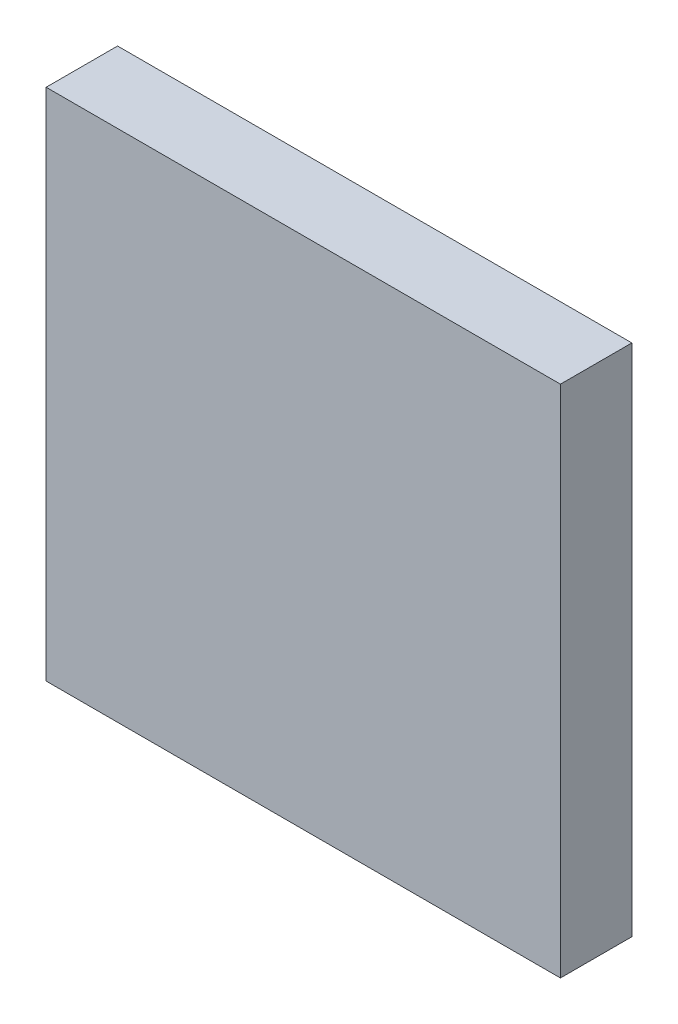
ISO-10303-21;
HEADER;
FILE_DESCRIPTION(('STEP AP214'),'2;1');
FILE_NAME('part.step','',(''),(''),'','','');
FILE_SCHEMA(('AUTOMOTIVE_DESIGN { 1 0 10303 214 1 1 1 1 }'));
ENDSEC;
DATA;
#1=APPLICATION_CONTEXT('core data for automotive mechanical design processes');
#2=APPLICATION_PROTOCOL_DEFINITION('international standard','automotive_design',2000,#1);
#3=PRODUCT_CONTEXT('',#1,'mechanical');
#4=PRODUCT('Part','Part','',(#3));
#5=PRODUCT_RELATED_PRODUCT_CATEGORY('part','',(#4));
#6=PRODUCT_DEFINITION_FORMATION('','',#4);
#7=PRODUCT_DEFINITION_CONTEXT('part definition',#1,'design');
#8=PRODUCT_DEFINITION('design','',#6,#7);
#9=PRODUCT_DEFINITION_SHAPE('','',#8);
#10=(LENGTH_UNIT() NAMED_UNIT(*) SI_UNIT(.MILLI.,.METRE.));
#11=(NAMED_UNIT(*) PLANE_ANGLE_UNIT() SI_UNIT($,.RADIAN.));
#12=(NAMED_UNIT(*) SI_UNIT($,.STERADIAN.) SOLID_ANGLE_UNIT());
#13=UNCERTAINTY_MEASURE_WITH_UNIT(LENGTH_MEASURE(1.E-05),#10,'distance_accuracy_value','');
#14=(GEOMETRIC_REPRESENTATION_CONTEXT(3) GLOBAL_UNCERTAINTY_ASSIGNED_CONTEXT((#13)) GLOBAL_UNIT_ASSIGNED_CONTEXT((#10,
#11,#12)) REPRESENTATION_CONTEXT('',''));
#15=CARTESIAN_POINT('',(0.,0.,0.));
#16=DIRECTION('',(0.,0.,1.));
#17=DIRECTION('',(1.,0.,0.));
#18=AXIS2_PLACEMENT_3D('',#15,#16,#17);
#19=CARTESIAN_POINT('',(0.,0.,0.));
#20=DIRECTION('',(0.,0.,1.));
#21=DIRECTION('',(1.,0.,0.));
#22=AXIS2_PLACEMENT_3D('',#19,#20,#21);
#23=PLANE('',#22);
#24=DIRECTION('',(0.,-1.,0.));
#25=VECTOR('',#24,1.);
#26=CARTESIAN_POINT('',(-0.154076439477094,2.24242424242424,0.));
#27=LINE('',#26,#25);
#28=CARTESIAN_POINT('',(-0.154076439477094,2.24242424242424,0.));
#29=VERTEX_POINT('',#28);
#30=CARTESIAN_POINT('',(-0.15407643947709,-33.7575757575758,0.));
#31=VERTEX_POINT('',#30);
#32=EDGE_CURVE('E79',#29,#31,#27,.T.);
#33=ORIENTED_EDGE('',*,*,#32,.F.);
#34=DIRECTION('',(-1.,0.,0.));
#35=VECTOR('',#34,1.);
#36=CARTESIAN_POINT('',(-0.154076439477094,2.24242424242424,0.));
#37=LINE('',#36,#35);
#38=CARTESIAN_POINT('',(35.8459235605229,2.24242424242424,0.));
#39=VERTEX_POINT('',#38);
#40=EDGE_CURVE('E48',#39,#29,#37,.T.);
#41=ORIENTED_EDGE('',*,*,#40,.F.);
#42=DIRECTION('',(0.,1.,0.));
#43=VECTOR('',#42,1.);
#44=CARTESIAN_POINT('',(35.8459235605229,2.24242424242424,0.));
#45=LINE('',#44,#43);
#46=CARTESIAN_POINT('',(35.8459235605229,-33.7575757575758,0.));
#47=VERTEX_POINT('',#46);
#48=EDGE_CURVE('E56',#47,#39,#45,.T.);
#49=ORIENTED_EDGE('',*,*,#48,.F.);
#50=DIRECTION('',(1.,0.,0.));
#51=VECTOR('',#50,1.);
#52=CARTESIAN_POINT('',(-0.15407643947709,-33.7575757575758,0.));
#53=LINE('',#52,#51);
#54=EDGE_CURVE('E146',#31,#47,#53,.T.);
#55=ORIENTED_EDGE('',*,*,#54,.F.);
#56=EDGE_LOOP('',(#33,#41,#49,#55));
#57=FACE_BOUND('',#56,.T.);
#58=CARTESIAN_POINT('',(2.5959235605229,-0.507575757575758,0.));
#59=DIRECTION('',(0.,0.,1.));
#60=DIRECTION('',(1.,0.,0.));
#61=AXIS2_PLACEMENT_3D('',#58,#59,#60);
#62=CIRCLE('',#61,2.);
#63=CARTESIAN_POINT('',(4.5959235605229,-0.507575757575758,0.));
#64=VERTEX_POINT('',#63);
#65=EDGE_CURVE('E142',#64,#64,#62,.T.);
#66=ORIENTED_EDGE('',*,*,#65,.T.);
#67=EDGE_LOOP('',(#66));
#68=FACE_BOUND('',#67,.T.);
#69=CARTESIAN_POINT('',(17.8459235605229,-0.507575757575758,0.));
#70=DIRECTION('',(0.,0.,1.));
#71=DIRECTION('',(1.,0.,0.));
#72=AXIS2_PLACEMENT_3D('',#69,#70,#71);
#73=CIRCLE('',#72,2.);
#74=CARTESIAN_POINT('',(19.8459235605229,-0.507575757575758,0.));
#75=VERTEX_POINT('',#74);
#76=EDGE_CURVE('E139',#75,#75,#73,.T.);
#77=ORIENTED_EDGE('',*,*,#76,.T.);
#78=EDGE_LOOP('',(#77));
#79=FACE_BOUND('',#78,.T.);
#80=CARTESIAN_POINT('',(33.0959235605229,-0.507575757575759,0.));
#81=DIRECTION('',(0.,0.,1.));
#82=DIRECTION('',(1.,0.,0.));
#83=AXIS2_PLACEMENT_3D('',#80,#81,#82);
#84=CIRCLE('',#83,2.);
#85=CARTESIAN_POINT('',(35.0959235605229,-0.507575757575759,0.));
#86=VERTEX_POINT('',#85);
#87=EDGE_CURVE('E136',#86,#86,#84,.T.);
#88=ORIENTED_EDGE('',*,*,#87,.T.);
#89=EDGE_LOOP('',(#88));
#90=FACE_BOUND('',#89,.T.);
#91=CARTESIAN_POINT('',(33.0959235605229,-15.7575757575758,0.));
#92=DIRECTION('',(0.,0.,1.));
#93=DIRECTION('',(1.,0.,0.));
#94=AXIS2_PLACEMENT_3D('',#91,#92,#93);
#95=CIRCLE('',#94,2.);
#96=CARTESIAN_POINT('',(35.0959235605229,-15.7575757575758,0.));
#97=VERTEX_POINT('',#96);
#98=EDGE_CURVE('E133',#97,#97,#95,.T.);
#99=ORIENTED_EDGE('',*,*,#98,.T.);
#100=EDGE_LOOP('',(#99));
#101=FACE_BOUND('',#100,.T.);
#102=CARTESIAN_POINT('',(33.0959235605229,-31.0075757575758,0.));
#103=DIRECTION('',(0.,0.,1.));
#104=DIRECTION('',(1.,0.,0.));
#105=AXIS2_PLACEMENT_3D('',#102,#103,#104);
#106=CIRCLE('',#105,2.);
#107=CARTESIAN_POINT('',(35.0959235605229,-31.0075757575758,0.));
#108=VERTEX_POINT('',#107);
#109=EDGE_CURVE('E130',#108,#108,#106,.T.);
#110=ORIENTED_EDGE('',*,*,#109,.T.);
#111=EDGE_LOOP('',(#110));
#112=FACE_BOUND('',#111,.T.);
#113=CARTESIAN_POINT('',(17.8459235605229,-31.0075757575758,0.));
#114=DIRECTION('',(0.,0.,1.));
#115=DIRECTION('',(1.,0.,0.));
#116=AXIS2_PLACEMENT_3D('',#113,#114,#115);
#117=CIRCLE('',#116,2.00000000000001);
#118=CARTESIAN_POINT('',(19.8459235605229,-31.0075757575758,0.));
#119=VERTEX_POINT('',#118);
#120=EDGE_CURVE('E127',#119,#119,#117,.T.);
#121=ORIENTED_EDGE('',*,*,#120,.T.);
#122=EDGE_LOOP('',(#121));
#123=FACE_BOUND('',#122,.T.);
#124=CARTESIAN_POINT('',(2.5959235605229,-31.0075757575758,0.));
#125=DIRECTION('',(0.,0.,1.));
#126=DIRECTION('',(1.,0.,0.));
#127=AXIS2_PLACEMENT_3D('',#124,#125,#126);
#128=CIRCLE('',#127,2.);
#129=CARTESIAN_POINT('',(4.5959235605229,-31.0075757575758,0.));
#130=VERTEX_POINT('',#129);
#131=EDGE_CURVE('E124',#130,#130,#128,.T.);
#132=ORIENTED_EDGE('',*,*,#131,.T.);
#133=EDGE_LOOP('',(#132));
#134=FACE_BOUND('',#133,.T.);
#135=CARTESIAN_POINT('',(2.59592356052291,-15.7575757575758,0.));
#136=DIRECTION('',(0.,0.,1.));
#137=DIRECTION('',(1.,0.,0.));
#138=AXIS2_PLACEMENT_3D('',#135,#136,#137);
#139=CIRCLE('',#138,2.);
#140=CARTESIAN_POINT('',(4.59592356052291,-15.7575757575758,0.));
#141=VERTEX_POINT('',#140);
#142=EDGE_CURVE('E121',#141,#141,#139,.T.);
#143=ORIENTED_EDGE('',*,*,#142,.T.);
#144=EDGE_LOOP('',(#143));
#145=FACE_BOUND('',#144,.T.);
#146=ADVANCED_FACE('F33',(#57,#68,#79,#90,#101,#112,#123,#134,#145),#23,.F.);
#147=CARTESIAN_POINT('',(-0.154076439477094,2.24242424242424,3.));
#148=DIRECTION('',(1.,0.,0.));
#149=DIRECTION('',(0.,1.,0.));
#150=AXIS2_PLACEMENT_3D('',#147,#148,#149);
#151=PLANE('',#150);
#152=ORIENTED_EDGE('',*,*,#32,.T.);
#153=DIRECTION('',(0.,0.,-1.));
#154=VECTOR('',#153,1.);
#155=CARTESIAN_POINT('',(-0.15407643947709,-33.7575757575758,3.));
#156=LINE('',#155,#154);
#157=CARTESIAN_POINT('',(-0.154076439477094,-33.7575757575758,5.));
#158=VERTEX_POINT('',#157);
#159=EDGE_CURVE('E11',#158,#31,#156,.T.);
#160=ORIENTED_EDGE('',*,*,#159,.F.);
#161=DIRECTION('',(0.,-1.,0.));
#162=VECTOR('',#161,1.);
#163=CARTESIAN_POINT('',(-0.154076439477094,2.24242424242424,5.));
#164=LINE('',#163,#162);
#165=CARTESIAN_POINT('',(-0.154076439477094,2.24242424242424,5.));
#166=VERTEX_POINT('',#165);
#167=EDGE_CURVE('E77',#166,#158,#164,.T.);
#168=ORIENTED_EDGE('',*,*,#167,.F.);
#169=DIRECTION('',(0.,0.,-1.));
#170=VECTOR('',#169,1.);
#171=CARTESIAN_POINT('',(-0.154076439477094,2.24242424242424,3.));
#172=LINE('',#171,#170);
#173=EDGE_CURVE('E150',#166,#29,#172,.T.);
#174=ORIENTED_EDGE('',*,*,#173,.T.);
#175=EDGE_LOOP('',(#152,#160,#168,#174));
#176=FACE_BOUND('',#175,.T.);
#177=ADVANCED_FACE('F35',(#176),#151,.F.);
#178=CARTESIAN_POINT('',(-0.15407643947709,-33.7575757575758,3.));
#179=DIRECTION('',(0.,1.,0.));
#180=DIRECTION('',(0.,0.,1.));
#181=AXIS2_PLACEMENT_3D('',#178,#179,#180);
#182=PLANE('',#181);
#183=ORIENTED_EDGE('',*,*,#54,.T.);
#184=DIRECTION('',(0.,0.,-1.));
#185=VECTOR('',#184,1.);
#186=CARTESIAN_POINT('',(35.8459235605229,-33.7575757575758,3.));
#187=LINE('',#186,#185);
#188=CARTESIAN_POINT('',(35.8459235605229,-33.7575757575758,5.));
#189=VERTEX_POINT('',#188);
#190=EDGE_CURVE('E41',#189,#47,#187,.T.);
#191=ORIENTED_EDGE('',*,*,#190,.F.);
#192=DIRECTION('',(1.,0.,0.));
#193=VECTOR('',#192,1.);
#194=CARTESIAN_POINT('',(-0.154076439477094,-33.7575757575758,5.));
#195=LINE('',#194,#193);
#196=EDGE_CURVE('E82',#158,#189,#195,.T.);
#197=ORIENTED_EDGE('',*,*,#196,.F.);
#198=ORIENTED_EDGE('',*,*,#159,.T.);
#199=EDGE_LOOP('',(#183,#191,#197,#198));
#200=FACE_BOUND('',#199,.T.);
#201=ADVANCED_FACE('F83',(#200),#182,.F.);
#202=CARTESIAN_POINT('',(35.8459235605229,2.24242424242424,3.));
#203=DIRECTION('',(-1.,0.,0.));
#204=DIRECTION('',(0.,-1.,0.));
#205=AXIS2_PLACEMENT_3D('',#202,#203,#204);
#206=PLANE('',#205);
#207=ORIENTED_EDGE('',*,*,#48,.T.);
#208=DIRECTION('',(0.,0.,-1.));
#209=VECTOR('',#208,1.);
#210=CARTESIAN_POINT('',(35.8459235605229,2.24242424242424,3.));
#211=LINE('',#210,#209);
#212=CARTESIAN_POINT('',(35.8459235605229,2.24242424242424,5.));
#213=VERTEX_POINT('',#212);
#214=EDGE_CURVE('E152',#213,#39,#211,.T.);
#215=ORIENTED_EDGE('',*,*,#214,.F.);
#216=DIRECTION('',(0.,1.,0.));
#217=VECTOR('',#216,1.);
#218=CARTESIAN_POINT('',(35.8459235605229,2.24242424242424,5.));
#219=LINE('',#218,#217);
#220=EDGE_CURVE('E87',#189,#213,#219,.T.);
#221=ORIENTED_EDGE('',*,*,#220,.F.);
#222=ORIENTED_EDGE('',*,*,#190,.T.);
#223=EDGE_LOOP('',(#207,#215,#221,#222));
#224=FACE_BOUND('',#223,.T.);
#225=ADVANCED_FACE('F153',(#224),#206,.F.);
#226=CARTESIAN_POINT('',(-0.154076439477094,2.24242424242424,3.));
#227=DIRECTION('',(0.,-1.,0.));
#228=DIRECTION('',(0.,0.,-1.));
#229=AXIS2_PLACEMENT_3D('',#226,#227,#228);
#230=PLANE('',#229);
#231=ORIENTED_EDGE('',*,*,#40,.T.);
#232=ORIENTED_EDGE('',*,*,#173,.F.);
#233=DIRECTION('',(-1.,0.,0.));
#234=VECTOR('',#233,1.);
#235=CARTESIAN_POINT('',(-0.154076439477094,2.24242424242424,5.));
#236=LINE('',#235,#234);
#237=EDGE_CURVE('E92',#213,#166,#236,.T.);
#238=ORIENTED_EDGE('',*,*,#237,.F.);
#239=ORIENTED_EDGE('',*,*,#214,.T.);
#240=EDGE_LOOP('',(#231,#232,#238,#239));
#241=FACE_BOUND('',#240,.T.);
#242=ADVANCED_FACE('F214',(#241),#230,.F.);
#243=CARTESIAN_POINT('',(2.5959235605229,-0.507575757575758,3.));
#244=DIRECTION('',(0.,0.,-1.));
#245=DIRECTION('',(-1.,0.,0.));
#246=AXIS2_PLACEMENT_3D('',#243,#244,#245);
#247=CYLINDRICAL_SURFACE('',#246,2.);
#248=CARTESIAN_POINT('',(2.5959235605229,-0.507575757575758,3.));
#249=DIRECTION('',(0.,0.,1.));
#250=DIRECTION('',(1.,0.,0.));
#251=AXIS2_PLACEMENT_3D('',#248,#249,#250);
#252=CIRCLE('',#251,2.);
#253=CARTESIAN_POINT('',(4.5959235605229,-0.507575757575758,3.));
#254=VERTEX_POINT('',#253);
#255=EDGE_CURVE('E118',#254,#254,#252,.T.);
#256=ORIENTED_EDGE('',*,*,#255,.T.);
#257=EDGE_LOOP('',(#256));
#258=FACE_BOUND('',#257,.T.);
#259=ORIENTED_EDGE('',*,*,#65,.F.);
#260=EDGE_LOOP('',(#259));
#261=FACE_BOUND('',#260,.T.);
#262=ADVANCED_FACE('F211',(#258,#261),#247,.F.);
#263=CARTESIAN_POINT('',(17.8459235605229,-0.507575757575758,3.));
#264=DIRECTION('',(0.,0.,-1.));
#265=DIRECTION('',(-1.,0.,0.));
#266=AXIS2_PLACEMENT_3D('',#263,#264,#265);
#267=CYLINDRICAL_SURFACE('',#266,2.);
#268=CARTESIAN_POINT('',(17.8459235605229,-0.507575757575758,3.));
#269=DIRECTION('',(0.,0.,1.));
#270=DIRECTION('',(1.,0.,0.));
#271=AXIS2_PLACEMENT_3D('',#268,#269,#270);
#272=CIRCLE('',#271,2.);
#273=CARTESIAN_POINT('',(19.8459235605229,-0.507575757575758,3.));
#274=VERTEX_POINT('',#273);
#275=EDGE_CURVE('E115',#274,#274,#272,.T.);
#276=ORIENTED_EDGE('',*,*,#275,.T.);
#277=EDGE_LOOP('',(#276));
#278=FACE_BOUND('',#277,.T.);
#279=ORIENTED_EDGE('',*,*,#76,.F.);
#280=EDGE_LOOP('',(#279));
#281=FACE_BOUND('',#280,.T.);
#282=ADVANCED_FACE('F207',(#278,#281),#267,.F.);
#283=CARTESIAN_POINT('',(33.0959235605229,-0.507575757575759,3.));
#284=DIRECTION('',(0.,0.,-1.));
#285=DIRECTION('',(-1.,0.,0.));
#286=AXIS2_PLACEMENT_3D('',#283,#284,#285);
#287=CYLINDRICAL_SURFACE('',#286,2.);
#288=CARTESIAN_POINT('',(33.0959235605229,-0.507575757575759,3.));
#289=DIRECTION('',(0.,0.,1.));
#290=DIRECTION('',(1.,0.,0.));
#291=AXIS2_PLACEMENT_3D('',#288,#289,#290);
#292=CIRCLE('',#291,2.);
#293=CARTESIAN_POINT('',(35.0959235605229,-0.507575757575759,3.));
#294=VERTEX_POINT('',#293);
#295=EDGE_CURVE('E112',#294,#294,#292,.T.);
#296=ORIENTED_EDGE('',*,*,#295,.T.);
#297=EDGE_LOOP('',(#296));
#298=FACE_BOUND('',#297,.T.);
#299=ORIENTED_EDGE('',*,*,#87,.F.);
#300=EDGE_LOOP('',(#299));
#301=FACE_BOUND('',#300,.T.);
#302=ADVANCED_FACE('F203',(#298,#301),#287,.F.);
#303=CARTESIAN_POINT('',(33.0959235605229,-15.7575757575758,3.));
#304=DIRECTION('',(0.,0.,-1.));
#305=DIRECTION('',(-1.,0.,0.));
#306=AXIS2_PLACEMENT_3D('',#303,#304,#305);
#307=CYLINDRICAL_SURFACE('',#306,2.);
#308=CARTESIAN_POINT('',(33.0959235605229,-15.7575757575758,3.));
#309=DIRECTION('',(0.,0.,1.));
#310=DIRECTION('',(1.,0.,0.));
#311=AXIS2_PLACEMENT_3D('',#308,#309,#310);
#312=CIRCLE('',#311,2.);
#313=CARTESIAN_POINT('',(35.0959235605229,-15.7575757575758,3.));
#314=VERTEX_POINT('',#313);
#315=EDGE_CURVE('E109',#314,#314,#312,.T.);
#316=ORIENTED_EDGE('',*,*,#315,.T.);
#317=EDGE_LOOP('',(#316));
#318=FACE_BOUND('',#317,.T.);
#319=ORIENTED_EDGE('',*,*,#98,.F.);
#320=EDGE_LOOP('',(#319));
#321=FACE_BOUND('',#320,.T.);
#322=ADVANCED_FACE('F199',(#318,#321),#307,.F.);
#323=CARTESIAN_POINT('',(33.0959235605229,-31.0075757575758,3.));
#324=DIRECTION('',(0.,0.,-1.));
#325=DIRECTION('',(-1.,0.,0.));
#326=AXIS2_PLACEMENT_3D('',#323,#324,#325);
#327=CYLINDRICAL_SURFACE('',#326,2.);
#328=CARTESIAN_POINT('',(33.0959235605229,-31.0075757575758,3.));
#329=DIRECTION('',(0.,0.,1.));
#330=DIRECTION('',(1.,0.,0.));
#331=AXIS2_PLACEMENT_3D('',#328,#329,#330);
#332=CIRCLE('',#331,2.);
#333=CARTESIAN_POINT('',(35.0959235605229,-31.0075757575758,3.));
#334=VERTEX_POINT('',#333);
#335=EDGE_CURVE('E106',#334,#334,#332,.T.);
#336=ORIENTED_EDGE('',*,*,#335,.T.);
#337=EDGE_LOOP('',(#336));
#338=FACE_BOUND('',#337,.T.);
#339=ORIENTED_EDGE('',*,*,#109,.F.);
#340=EDGE_LOOP('',(#339));
#341=FACE_BOUND('',#340,.T.);
#342=ADVANCED_FACE('F195',(#338,#341),#327,.F.);
#343=CARTESIAN_POINT('',(17.8459235605229,-31.0075757575758,3.));
#344=DIRECTION('',(0.,0.,-1.));
#345=DIRECTION('',(-1.,0.,0.));
#346=AXIS2_PLACEMENT_3D('',#343,#344,#345);
#347=CYLINDRICAL_SURFACE('',#346,2.00000000000001);
#348=CARTESIAN_POINT('',(17.8459235605229,-31.0075757575758,3.));
#349=DIRECTION('',(0.,0.,1.));
#350=DIRECTION('',(1.,0.,0.));
#351=AXIS2_PLACEMENT_3D('',#348,#349,#350);
#352=CIRCLE('',#351,2.00000000000001);
#353=CARTESIAN_POINT('',(19.8459235605229,-31.0075757575758,3.));
#354=VERTEX_POINT('',#353);
#355=EDGE_CURVE('E103',#354,#354,#352,.T.);
#356=ORIENTED_EDGE('',*,*,#355,.T.);
#357=EDGE_LOOP('',(#356));
#358=FACE_BOUND('',#357,.T.);
#359=ORIENTED_EDGE('',*,*,#120,.F.);
#360=EDGE_LOOP('',(#359));
#361=FACE_BOUND('',#360,.T.);
#362=ADVANCED_FACE('F188',(#358,#361),#347,.F.);
#363=CARTESIAN_POINT('',(2.5959235605229,-31.0075757575758,3.));
#364=DIRECTION('',(0.,0.,-1.));
#365=DIRECTION('',(-1.,0.,0.));
#366=AXIS2_PLACEMENT_3D('',#363,#364,#365);
#367=CYLINDRICAL_SURFACE('',#366,2.);
#368=CARTESIAN_POINT('',(2.5959235605229,-31.0075757575758,3.));
#369=DIRECTION('',(0.,0.,1.));
#370=DIRECTION('',(1.,0.,0.));
#371=AXIS2_PLACEMENT_3D('',#368,#369,#370);
#372=CIRCLE('',#371,2.);
#373=CARTESIAN_POINT('',(4.5959235605229,-31.0075757575758,3.));
#374=VERTEX_POINT('',#373);
#375=EDGE_CURVE('E100',#374,#374,#372,.T.);
#376=ORIENTED_EDGE('',*,*,#375,.T.);
#377=EDGE_LOOP('',(#376));
#378=FACE_BOUND('',#377,.T.);
#379=ORIENTED_EDGE('',*,*,#131,.F.);
#380=EDGE_LOOP('',(#379));
#381=FACE_BOUND('',#380,.T.);
#382=ADVANCED_FACE('F177',(#378,#381),#367,.F.);
#383=CARTESIAN_POINT('',(2.59592356052291,-15.7575757575758,3.));
#384=DIRECTION('',(0.,0.,-1.));
#385=DIRECTION('',(-1.,0.,0.));
#386=AXIS2_PLACEMENT_3D('',#383,#384,#385);
#387=CYLINDRICAL_SURFACE('',#386,2.);
#388=CARTESIAN_POINT('',(2.59592356052291,-15.7575757575758,3.));
#389=DIRECTION('',(0.,0.,1.));
#390=DIRECTION('',(1.,0.,0.));
#391=AXIS2_PLACEMENT_3D('',#388,#389,#390);
#392=CIRCLE('',#391,2.);
#393=CARTESIAN_POINT('',(4.59592356052291,-15.7575757575758,3.));
#394=VERTEX_POINT('',#393);
#395=EDGE_CURVE('E97',#394,#394,#392,.T.);
#396=ORIENTED_EDGE('',*,*,#395,.T.);
#397=EDGE_LOOP('',(#396));
#398=FACE_BOUND('',#397,.T.);
#399=ORIENTED_EDGE('',*,*,#142,.F.);
#400=EDGE_LOOP('',(#399));
#401=FACE_BOUND('',#400,.T.);
#402=ADVANCED_FACE('F174',(#398,#401),#387,.F.);
#403=CARTESIAN_POINT('',(0.,0.,3.));
#404=DIRECTION('',(0.,0.,1.));
#405=DIRECTION('',(1.,0.,0.));
#406=AXIS2_PLACEMENT_3D('',#403,#404,#405);
#407=PLANE('',#406);
#408=ORIENTED_EDGE('',*,*,#395,.F.);
#409=EDGE_LOOP('',(#408));
#410=FACE_BOUND('',#409,.T.);
#411=ADVANCED_FACE('F176',(#410),#407,.F.);
#412=ORIENTED_EDGE('',*,*,#375,.F.);
#413=EDGE_LOOP('',(#412));
#414=FACE_BOUND('',#413,.T.);
#415=ADVANCED_FACE('F184',(#414),#407,.F.);
#416=ORIENTED_EDGE('',*,*,#355,.F.);
#417=EDGE_LOOP('',(#416));
#418=FACE_BOUND('',#417,.T.);
#419=ADVANCED_FACE('F319',(#418),#407,.F.);
#420=ORIENTED_EDGE('',*,*,#335,.F.);
#421=EDGE_LOOP('',(#420));
#422=FACE_BOUND('',#421,.T.);
#423=ADVANCED_FACE('F327',(#422),#407,.F.);
#424=ORIENTED_EDGE('',*,*,#315,.F.);
#425=EDGE_LOOP('',(#424));
#426=FACE_BOUND('',#425,.T.);
#427=ADVANCED_FACE('F335',(#426),#407,.F.);
#428=ORIENTED_EDGE('',*,*,#295,.F.);
#429=EDGE_LOOP('',(#428));
#430=FACE_BOUND('',#429,.T.);
#431=ADVANCED_FACE('F343',(#430),#407,.F.);
#432=ORIENTED_EDGE('',*,*,#275,.F.);
#433=EDGE_LOOP('',(#432));
#434=FACE_BOUND('',#433,.T.);
#435=ADVANCED_FACE('F351',(#434),#407,.F.);
#436=ORIENTED_EDGE('',*,*,#255,.F.);
#437=EDGE_LOOP('',(#436));
#438=FACE_BOUND('',#437,.T.);
#439=ADVANCED_FACE('F187',(#438),#407,.F.);
#440=CARTESIAN_POINT('',(0.,0.,5.));
#441=DIRECTION('',(0.,0.,1.));
#442=DIRECTION('',(1.,0.,0.));
#443=AXIS2_PLACEMENT_3D('',#440,#441,#442);
#444=PLANE('',#443);
#445=ORIENTED_EDGE('',*,*,#167,.T.);
#446=ORIENTED_EDGE('',*,*,#196,.T.);
#447=ORIENTED_EDGE('',*,*,#220,.T.);
#448=ORIENTED_EDGE('',*,*,#237,.T.);
#449=EDGE_LOOP('',(#445,#446,#447,#448));
#450=FACE_BOUND('',#449,.T.);
#451=ADVANCED_FACE('F90',(#450),#444,.T.);
#452=CLOSED_SHELL('',(#146,#177,#201,#225,#242,#262,#282,#302,#322,#342,#362,#382,#402,#411,
#415,#419,#423,#427,#431,#435,#439,#451));
#453=MANIFOLD_SOLID_BREP('B2',#452);
#454=ADVANCED_BREP_SHAPE_REPRESENTATION('',(#18,#453),#14);
#455=SHAPE_DEFINITION_REPRESENTATION(#9,#454);
ENDSEC;
END-ISO-10303-21;
